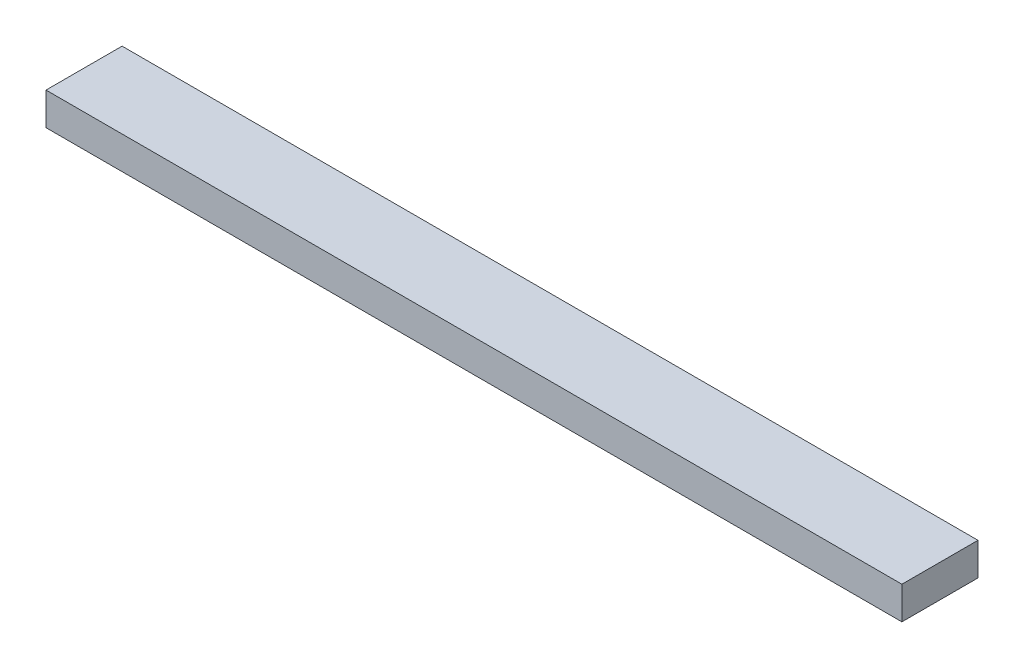
ISO-10303-21;
HEADER;
FILE_DESCRIPTION(('STEP AP214'),'2;1');
FILE_NAME('part.step','',(''),(''),'','','');
FILE_SCHEMA(('AUTOMOTIVE_DESIGN { 1 0 10303 214 1 1 1 1 }'));
ENDSEC;
DATA;
#1=APPLICATION_CONTEXT('core data for automotive mechanical design processes');
#2=APPLICATION_PROTOCOL_DEFINITION('international standard','automotive_design',2000,#1);
#3=PRODUCT_CONTEXT('',#1,'mechanical');
#4=PRODUCT('Part','Part','',(#3));
#5=PRODUCT_RELATED_PRODUCT_CATEGORY('part','',(#4));
#6=PRODUCT_DEFINITION_FORMATION('','',#4);
#7=PRODUCT_DEFINITION_CONTEXT('part definition',#1,'design');
#8=PRODUCT_DEFINITION('design','',#6,#7);
#9=PRODUCT_DEFINITION_SHAPE('','',#8);
#10=(LENGTH_UNIT() NAMED_UNIT(*) SI_UNIT(.MILLI.,.METRE.));
#11=(NAMED_UNIT(*) PLANE_ANGLE_UNIT() SI_UNIT($,.RADIAN.));
#12=(NAMED_UNIT(*) SI_UNIT($,.STERADIAN.) SOLID_ANGLE_UNIT());
#13=UNCERTAINTY_MEASURE_WITH_UNIT(LENGTH_MEASURE(1.E-05),#10,'distance_accuracy_value','');
#14=(GEOMETRIC_REPRESENTATION_CONTEXT(3) GLOBAL_UNCERTAINTY_ASSIGNED_CONTEXT((#13)) GLOBAL_UNIT_ASSIGNED_CONTEXT((#10,
#11,#12)) REPRESENTATION_CONTEXT('',''));
#15=CARTESIAN_POINT('',(0.,0.,0.));
#16=DIRECTION('',(0.,0.,1.));
#17=DIRECTION('',(1.,0.,0.));
#18=AXIS2_PLACEMENT_3D('',#15,#16,#17);
#19=CARTESIAN_POINT('',(0.,38.1,0.));
#20=DIRECTION('',(1.,0.,0.));
#21=DIRECTION('',(0.,0.,-1.));
#22=AXIS2_PLACEMENT_3D('',#19,#20,#21);
#23=PLANE('',#22);
#24=DIRECTION('',(0.,0.,1.));
#25=VECTOR('',#24,1.);
#26=CARTESIAN_POINT('',(0.,0.,0.));
#27=LINE('',#26,#25);
#28=CARTESIAN_POINT('',(0.,0.,-88.9));
#29=VERTEX_POINT('',#28);
#30=CARTESIAN_POINT('',(0.,0.,0.));
#31=VERTEX_POINT('',#30);
#32=EDGE_CURVE('E113',#29,#31,#27,.T.);
#33=ORIENTED_EDGE('',*,*,#32,.T.);
#34=DIRECTION('',(0.,-1.,0.));
#35=VECTOR('',#34,1.);
#36=CARTESIAN_POINT('',(0.,38.1,0.));
#37=LINE('',#36,#35);
#38=CARTESIAN_POINT('',(0.,38.1,0.));
#39=VERTEX_POINT('',#38);
#40=EDGE_CURVE('E11',#39,#31,#37,.T.);
#41=ORIENTED_EDGE('',*,*,#40,.F.);
#42=DIRECTION('',(0.,0.,1.));
#43=VECTOR('',#42,1.);
#44=CARTESIAN_POINT('',(0.,38.1,0.));
#45=LINE('',#44,#43);
#46=CARTESIAN_POINT('',(0.,38.1,-88.9));
#47=VERTEX_POINT('',#46);
#48=EDGE_CURVE('E97',#47,#39,#45,.T.);
#49=ORIENTED_EDGE('',*,*,#48,.F.);
#50=DIRECTION('',(0.,-1.,0.));
#51=VECTOR('',#50,1.);
#52=CARTESIAN_POINT('',(0.,38.1,-88.9));
#53=LINE('',#52,#51);
#54=EDGE_CURVE('E109',#47,#29,#53,.T.);
#55=ORIENTED_EDGE('',*,*,#54,.T.);
#56=EDGE_LOOP('',(#33,#41,#49,#55));
#57=FACE_BOUND('',#56,.T.);
#58=ADVANCED_FACE('F45',(#57),#23,.F.);
#59=CARTESIAN_POINT('',(0.,38.1,0.));
#60=DIRECTION('',(0.,0.,-1.));
#61=DIRECTION('',(-1.,0.,0.));
#62=AXIS2_PLACEMENT_3D('',#59,#60,#61);
#63=PLANE('',#62);
#64=DIRECTION('',(1.,0.,0.));
#65=VECTOR('',#64,1.);
#66=CARTESIAN_POINT('',(0.,0.,0.));
#67=LINE('',#66,#65);
#68=CARTESIAN_POINT('',(1000.,0.,0.));
#69=VERTEX_POINT('',#68);
#70=EDGE_CURVE('E102',#31,#69,#67,.T.);
#71=ORIENTED_EDGE('',*,*,#70,.T.);
#72=DIRECTION('',(0.,-1.,0.));
#73=VECTOR('',#72,1.);
#74=CARTESIAN_POINT('',(1000.,38.1,0.));
#75=LINE('',#74,#73);
#76=CARTESIAN_POINT('',(1000.,38.1,0.));
#77=VERTEX_POINT('',#76);
#78=EDGE_CURVE('E54',#77,#69,#75,.T.);
#79=ORIENTED_EDGE('',*,*,#78,.F.);
#80=DIRECTION('',(1.,0.,0.));
#81=VECTOR('',#80,1.);
#82=CARTESIAN_POINT('',(0.,38.1,0.));
#83=LINE('',#82,#81);
#84=EDGE_CURVE('E92',#39,#77,#83,.T.);
#85=ORIENTED_EDGE('',*,*,#84,.F.);
#86=ORIENTED_EDGE('',*,*,#40,.T.);
#87=EDGE_LOOP('',(#71,#79,#85,#86));
#88=FACE_BOUND('',#87,.T.);
#89=ADVANCED_FACE('F101',(#88),#63,.F.);
#90=CARTESIAN_POINT('',(1000.,38.1,0.));
#91=DIRECTION('',(-1.,0.,0.));
#92=DIRECTION('',(0.,0.,1.));
#93=AXIS2_PLACEMENT_3D('',#90,#91,#92);
#94=PLANE('',#93);
#95=DIRECTION('',(0.,0.,-1.));
#96=VECTOR('',#95,1.);
#97=CARTESIAN_POINT('',(1000.,0.,0.));
#98=LINE('',#97,#96);
#99=CARTESIAN_POINT('',(1000.,0.,-88.9));
#100=VERTEX_POINT('',#99);
#101=EDGE_CURVE('E79',#69,#100,#98,.T.);
#102=ORIENTED_EDGE('',*,*,#101,.T.);
#103=DIRECTION('',(0.,-1.,0.));
#104=VECTOR('',#103,1.);
#105=CARTESIAN_POINT('',(1000.,38.1,-88.9));
#106=LINE('',#105,#104);
#107=CARTESIAN_POINT('',(1000.,38.1,-88.9));
#108=VERTEX_POINT('',#107);
#109=EDGE_CURVE('E104',#108,#100,#106,.T.);
#110=ORIENTED_EDGE('',*,*,#109,.F.);
#111=DIRECTION('',(0.,0.,-1.));
#112=VECTOR('',#111,1.);
#113=CARTESIAN_POINT('',(1000.,38.1,0.));
#114=LINE('',#113,#112);
#115=EDGE_CURVE('E95',#77,#108,#114,.T.);
#116=ORIENTED_EDGE('',*,*,#115,.F.);
#117=ORIENTED_EDGE('',*,*,#78,.T.);
#118=EDGE_LOOP('',(#102,#110,#116,#117));
#119=FACE_BOUND('',#118,.T.);
#120=ADVANCED_FACE('F105',(#119),#94,.F.);
#121=CARTESIAN_POINT('',(0.,38.1,-88.9));
#122=DIRECTION('',(0.,0.,1.));
#123=DIRECTION('',(1.,0.,0.));
#124=AXIS2_PLACEMENT_3D('',#121,#122,#123);
#125=PLANE('',#124);
#126=DIRECTION('',(-1.,0.,0.));
#127=VECTOR('',#126,1.);
#128=CARTESIAN_POINT('',(0.,0.,-88.9));
#129=LINE('',#128,#127);
#130=EDGE_CURVE('E85',#100,#29,#129,.T.);
#131=ORIENTED_EDGE('',*,*,#130,.T.);
#132=ORIENTED_EDGE('',*,*,#54,.F.);
#133=DIRECTION('',(-1.,0.,0.));
#134=VECTOR('',#133,1.);
#135=CARTESIAN_POINT('',(0.,38.1,-88.9));
#136=LINE('',#135,#134);
#137=EDGE_CURVE('E62',#108,#47,#136,.T.);
#138=ORIENTED_EDGE('',*,*,#137,.F.);
#139=ORIENTED_EDGE('',*,*,#109,.T.);
#140=EDGE_LOOP('',(#131,#132,#138,#139));
#141=FACE_BOUND('',#140,.T.);
#142=ADVANCED_FACE('F126',(#141),#125,.F.);
#143=CARTESIAN_POINT('',(0.,38.1,0.));
#144=DIRECTION('',(0.,-1.,0.));
#145=DIRECTION('',(0.,0.,-1.));
#146=AXIS2_PLACEMENT_3D('',#143,#144,#145);
#147=PLANE('',#146);
#148=ORIENTED_EDGE('',*,*,#48,.T.);
#149=ORIENTED_EDGE('',*,*,#84,.T.);
#150=ORIENTED_EDGE('',*,*,#115,.T.);
#151=ORIENTED_EDGE('',*,*,#137,.T.);
#152=EDGE_LOOP('',(#148,#149,#150,#151));
#153=FACE_BOUND('',#152,.T.);
#154=ADVANCED_FACE('F93',(#153),#147,.F.);
#155=CARTESIAN_POINT('',(0.,0.,0.));
#156=DIRECTION('',(0.,-1.,0.));
#157=DIRECTION('',(0.,0.,-1.));
#158=AXIS2_PLACEMENT_3D('',#155,#156,#157);
#159=PLANE('',#158);
#160=ORIENTED_EDGE('',*,*,#32,.F.);
#161=ORIENTED_EDGE('',*,*,#130,.F.);
#162=ORIENTED_EDGE('',*,*,#101,.F.);
#163=ORIENTED_EDGE('',*,*,#70,.F.);
#164=EDGE_LOOP('',(#160,#161,#162,#163));
#165=FACE_BOUND('',#164,.T.);
#166=ADVANCED_FACE('F129',(#165),#159,.T.);
#167=CLOSED_SHELL('',(#58,#89,#120,#142,#154,#166));
#168=MANIFOLD_SOLID_BREP('B2',#167);
#169=ADVANCED_BREP_SHAPE_REPRESENTATION('',(#18,#168),#14);
#170=SHAPE_DEFINITION_REPRESENTATION(#9,#169);
ENDSEC;
END-ISO-10303-21;
